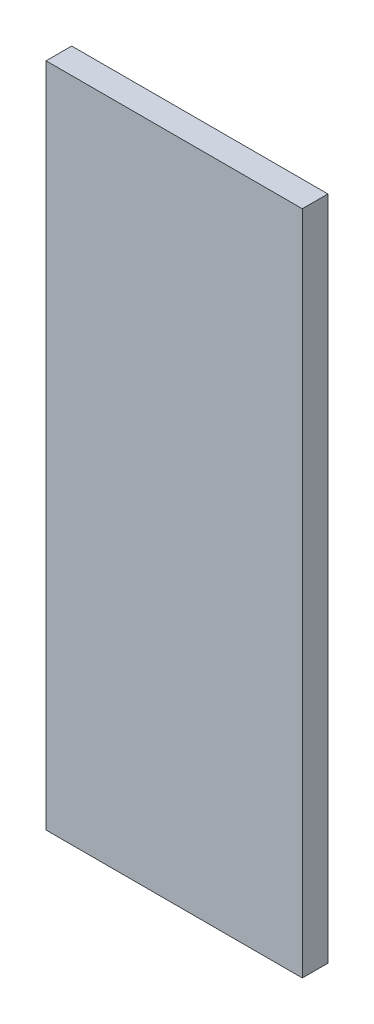
ISO-10303-21;
HEADER;
FILE_DESCRIPTION(('STEP AP214'),'2;1');
FILE_NAME('part.step','',(''),(''),'','','');
FILE_SCHEMA(('AUTOMOTIVE_DESIGN { 1 0 10303 214 1 1 1 1 }'));
ENDSEC;
DATA;
#1=APPLICATION_CONTEXT('core data for automotive mechanical design processes');
#2=APPLICATION_PROTOCOL_DEFINITION('international standard','automotive_design',2000,#1);
#3=PRODUCT_CONTEXT('',#1,'mechanical');
#4=PRODUCT('Part','Part','',(#3));
#5=PRODUCT_RELATED_PRODUCT_CATEGORY('part','',(#4));
#6=PRODUCT_DEFINITION_FORMATION('','',#4);
#7=PRODUCT_DEFINITION_CONTEXT('part definition',#1,'design');
#8=PRODUCT_DEFINITION('design','',#6,#7);
#9=PRODUCT_DEFINITION_SHAPE('','',#8);
#10=(LENGTH_UNIT() NAMED_UNIT(*) SI_UNIT(.MILLI.,.METRE.));
#11=(NAMED_UNIT(*) PLANE_ANGLE_UNIT() SI_UNIT($,.RADIAN.));
#12=(NAMED_UNIT(*) SI_UNIT($,.STERADIAN.) SOLID_ANGLE_UNIT());
#13=UNCERTAINTY_MEASURE_WITH_UNIT(LENGTH_MEASURE(1.E-05),#10,'distance_accuracy_value','');
#14=(GEOMETRIC_REPRESENTATION_CONTEXT(3) GLOBAL_UNCERTAINTY_ASSIGNED_CONTEXT((#13)) GLOBAL_UNIT_ASSIGNED_CONTEXT((#10,
#11,#12)) REPRESENTATION_CONTEXT('',''));
#15=CARTESIAN_POINT('',(0.,0.,0.));
#16=DIRECTION('',(0.,0.,1.));
#17=DIRECTION('',(1.,0.,0.));
#18=AXIS2_PLACEMENT_3D('',#15,#16,#17);
#19=CARTESIAN_POINT('',(25.,-65.,5.));
#20=DIRECTION('',(-1.,0.,0.));
#21=DIRECTION('',(0.,0.,1.));
#22=AXIS2_PLACEMENT_3D('',#19,#20,#21);
#23=PLANE('',#22);
#24=DIRECTION('',(0.,1.,0.));
#25=VECTOR('',#24,1.);
#26=CARTESIAN_POINT('',(25.,-65.,0.));
#27=LINE('',#26,#25);
#28=CARTESIAN_POINT('',(25.,-65.,0.));
#29=VERTEX_POINT('',#28);
#30=CARTESIAN_POINT('',(25.,65.,0.));
#31=VERTEX_POINT('',#30);
#32=EDGE_CURVE('E111',#29,#31,#27,.T.);
#33=ORIENTED_EDGE('',*,*,#32,.T.);
#34=DIRECTION('',(0.,0.,-1.));
#35=VECTOR('',#34,1.);
#36=CARTESIAN_POINT('',(25.,65.,5.));
#37=LINE('',#36,#35);
#38=CARTESIAN_POINT('',(25.,65.,5.));
#39=VERTEX_POINT('',#38);
#40=EDGE_CURVE('E11',#39,#31,#37,.T.);
#41=ORIENTED_EDGE('',*,*,#40,.F.);
#42=DIRECTION('',(0.,1.,0.));
#43=VECTOR('',#42,1.);
#44=CARTESIAN_POINT('',(25.,-65.,5.));
#45=LINE('',#44,#43);
#46=CARTESIAN_POINT('',(25.,-65.,5.));
#47=VERTEX_POINT('',#46);
#48=EDGE_CURVE('E95',#47,#39,#45,.T.);
#49=ORIENTED_EDGE('',*,*,#48,.F.);
#50=DIRECTION('',(0.,0.,-1.));
#51=VECTOR('',#50,1.);
#52=CARTESIAN_POINT('',(25.,-65.,5.));
#53=LINE('',#52,#51);
#54=EDGE_CURVE('E107',#47,#29,#53,.T.);
#55=ORIENTED_EDGE('',*,*,#54,.T.);
#56=EDGE_LOOP('',(#33,#41,#49,#55));
#57=FACE_BOUND('',#56,.T.);
#58=ADVANCED_FACE('F43',(#57),#23,.F.);
#59=CARTESIAN_POINT('',(-25.,65.,5.));
#60=DIRECTION('',(0.,-1.,0.));
#61=DIRECTION('',(0.,0.,-1.));
#62=AXIS2_PLACEMENT_3D('',#59,#60,#61);
#63=PLANE('',#62);
#64=DIRECTION('',(-1.,0.,0.));
#65=VECTOR('',#64,1.);
#66=CARTESIAN_POINT('',(-25.,65.,0.));
#67=LINE('',#66,#65);
#68=CARTESIAN_POINT('',(-25.,65.,0.));
#69=VERTEX_POINT('',#68);
#70=EDGE_CURVE('E100',#31,#69,#67,.T.);
#71=ORIENTED_EDGE('',*,*,#70,.T.);
#72=DIRECTION('',(0.,0.,-1.));
#73=VECTOR('',#72,1.);
#74=CARTESIAN_POINT('',(-25.,65.,5.));
#75=LINE('',#74,#73);
#76=CARTESIAN_POINT('',(-25.,65.,5.));
#77=VERTEX_POINT('',#76);
#78=EDGE_CURVE('E52',#77,#69,#75,.T.);
#79=ORIENTED_EDGE('',*,*,#78,.F.);
#80=DIRECTION('',(-1.,0.,0.));
#81=VECTOR('',#80,1.);
#82=CARTESIAN_POINT('',(-25.,65.,5.));
#83=LINE('',#82,#81);
#84=EDGE_CURVE('E90',#39,#77,#83,.T.);
#85=ORIENTED_EDGE('',*,*,#84,.F.);
#86=ORIENTED_EDGE('',*,*,#40,.T.);
#87=EDGE_LOOP('',(#71,#79,#85,#86));
#88=FACE_BOUND('',#87,.T.);
#89=ADVANCED_FACE('F99',(#88),#63,.F.);
#90=CARTESIAN_POINT('',(-25.,-65.,5.));
#91=DIRECTION('',(1.,0.,0.));
#92=DIRECTION('',(0.,0.,-1.));
#93=AXIS2_PLACEMENT_3D('',#90,#91,#92);
#94=PLANE('',#93);
#95=DIRECTION('',(0.,-1.,0.));
#96=VECTOR('',#95,1.);
#97=CARTESIAN_POINT('',(-25.,-65.,0.));
#98=LINE('',#97,#96);
#99=CARTESIAN_POINT('',(-25.,-65.,0.));
#100=VERTEX_POINT('',#99);
#101=EDGE_CURVE('E77',#69,#100,#98,.T.);
#102=ORIENTED_EDGE('',*,*,#101,.T.);
#103=DIRECTION('',(0.,0.,-1.));
#104=VECTOR('',#103,1.);
#105=CARTESIAN_POINT('',(-25.,-65.,5.));
#106=LINE('',#105,#104);
#107=CARTESIAN_POINT('',(-25.,-65.,5.));
#108=VERTEX_POINT('',#107);
#109=EDGE_CURVE('E102',#108,#100,#106,.T.);
#110=ORIENTED_EDGE('',*,*,#109,.F.);
#111=DIRECTION('',(0.,-1.,0.));
#112=VECTOR('',#111,1.);
#113=CARTESIAN_POINT('',(-25.,-65.,5.));
#114=LINE('',#113,#112);
#115=EDGE_CURVE('E93',#77,#108,#114,.T.);
#116=ORIENTED_EDGE('',*,*,#115,.F.);
#117=ORIENTED_EDGE('',*,*,#78,.T.);
#118=EDGE_LOOP('',(#102,#110,#116,#117));
#119=FACE_BOUND('',#118,.T.);
#120=ADVANCED_FACE('F103',(#119),#94,.F.);
#121=CARTESIAN_POINT('',(-25.,-65.,5.));
#122=DIRECTION('',(0.,1.,0.));
#123=DIRECTION('',(0.,0.,1.));
#124=AXIS2_PLACEMENT_3D('',#121,#122,#123);
#125=PLANE('',#124);
#126=DIRECTION('',(1.,0.,0.));
#127=VECTOR('',#126,1.);
#128=CARTESIAN_POINT('',(-25.,-65.,0.));
#129=LINE('',#128,#127);
#130=EDGE_CURVE('E83',#100,#29,#129,.T.);
#131=ORIENTED_EDGE('',*,*,#130,.T.);
#132=ORIENTED_EDGE('',*,*,#54,.F.);
#133=DIRECTION('',(1.,0.,0.));
#134=VECTOR('',#133,1.);
#135=CARTESIAN_POINT('',(-25.,-65.,5.));
#136=LINE('',#135,#134);
#137=EDGE_CURVE('E60',#108,#47,#136,.T.);
#138=ORIENTED_EDGE('',*,*,#137,.F.);
#139=ORIENTED_EDGE('',*,*,#109,.T.);
#140=EDGE_LOOP('',(#131,#132,#138,#139));
#141=FACE_BOUND('',#140,.T.);
#142=ADVANCED_FACE('F124',(#141),#125,.F.);
#143=CARTESIAN_POINT('',(0.,0.,5.));
#144=DIRECTION('',(0.,0.,-1.));
#145=DIRECTION('',(-1.,0.,0.));
#146=AXIS2_PLACEMENT_3D('',#143,#144,#145);
#147=PLANE('',#146);
#148=ORIENTED_EDGE('',*,*,#48,.T.);
#149=ORIENTED_EDGE('',*,*,#84,.T.);
#150=ORIENTED_EDGE('',*,*,#115,.T.);
#151=ORIENTED_EDGE('',*,*,#137,.T.);
#152=EDGE_LOOP('',(#148,#149,#150,#151));
#153=FACE_BOUND('',#152,.T.);
#154=ADVANCED_FACE('F91',(#153),#147,.F.);
#155=CARTESIAN_POINT('',(0.,0.,0.));
#156=DIRECTION('',(0.,0.,-1.));
#157=DIRECTION('',(-1.,0.,0.));
#158=AXIS2_PLACEMENT_3D('',#155,#156,#157);
#159=PLANE('',#158);
#160=ORIENTED_EDGE('',*,*,#32,.F.);
#161=ORIENTED_EDGE('',*,*,#130,.F.);
#162=ORIENTED_EDGE('',*,*,#101,.F.);
#163=ORIENTED_EDGE('',*,*,#70,.F.);
#164=EDGE_LOOP('',(#160,#161,#162,#163));
#165=FACE_BOUND('',#164,.T.);
#166=ADVANCED_FACE('F127',(#165),#159,.T.);
#167=CLOSED_SHELL('',(#58,#89,#120,#142,#154,#166));
#168=MANIFOLD_SOLID_BREP('B2',#167);
#169=ADVANCED_BREP_SHAPE_REPRESENTATION('',(#18,#168),#14);
#170=SHAPE_DEFINITION_REPRESENTATION(#9,#169);
ENDSEC;
END-ISO-10303-21;
